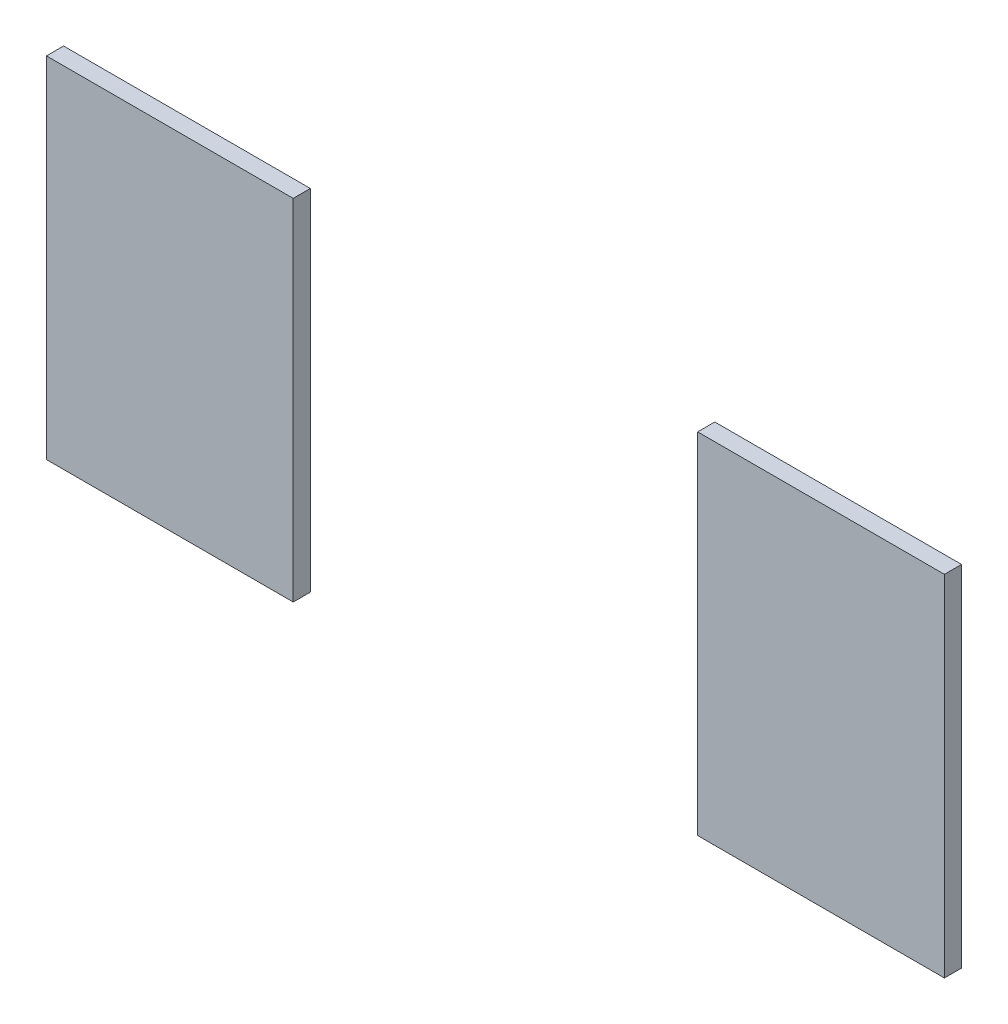
ISO-10303-21;
HEADER;
FILE_DESCRIPTION(('STEP AP214'),'2;1');
FILE_NAME('part.step','',(''),(''),'','','');
FILE_SCHEMA(('AUTOMOTIVE_DESIGN { 1 0 10303 214 1 1 1 1 }'));
ENDSEC;
DATA;
#1=APPLICATION_CONTEXT('core data for automotive mechanical design processes');
#2=APPLICATION_PROTOCOL_DEFINITION('international standard','automotive_design',2000,#1);
#3=PRODUCT_CONTEXT('',#1,'mechanical');
#4=PRODUCT('Part','Part','',(#3));
#5=PRODUCT_RELATED_PRODUCT_CATEGORY('part','',(#4));
#6=PRODUCT_DEFINITION_FORMATION('','',#4);
#7=PRODUCT_DEFINITION_CONTEXT('part definition',#1,'design');
#8=PRODUCT_DEFINITION('design','',#6,#7);
#9=PRODUCT_DEFINITION_SHAPE('','',#8);
#10=(LENGTH_UNIT() NAMED_UNIT(*) SI_UNIT(.MILLI.,.METRE.));
#11=(NAMED_UNIT(*) PLANE_ANGLE_UNIT() SI_UNIT($,.RADIAN.));
#12=(NAMED_UNIT(*) SI_UNIT($,.STERADIAN.) SOLID_ANGLE_UNIT());
#13=UNCERTAINTY_MEASURE_WITH_UNIT(LENGTH_MEASURE(1.E-05),#10,'distance_accuracy_value','');
#14=(GEOMETRIC_REPRESENTATION_CONTEXT(3) GLOBAL_UNCERTAINTY_ASSIGNED_CONTEXT((#13)) GLOBAL_UNIT_ASSIGNED_CONTEXT((#10,
#11,#12)) REPRESENTATION_CONTEXT('',''));
#15=CARTESIAN_POINT('',(0.,0.,0.));
#16=DIRECTION('',(0.,0.,1.));
#17=DIRECTION('',(1.,0.,0.));
#18=AXIS2_PLACEMENT_3D('',#15,#16,#17);
#19=CARTESIAN_POINT('',(-2.62,-1.02,0.1));
#20=DIRECTION('',(0.,0.,1.));
#21=DIRECTION('',(1.,0.,0.));
#22=AXIS2_PLACEMENT_3D('',#19,#20,#21);
#23=PLANE('',#22);
#24=DIRECTION('',(0.,1.,0.));
#25=VECTOR('',#24,1.);
#26=CARTESIAN_POINT('',(-2.62,-1.02,0.1));
#27=LINE('',#26,#25);
#28=CARTESIAN_POINT('',(-2.62,-1.02,0.1));
#29=VERTEX_POINT('',#28);
#30=CARTESIAN_POINT('',(-2.62,1.02,0.1));
#31=VERTEX_POINT('',#30);
#32=EDGE_CURVE('P0_E96',#29,#31,#27,.T.);
#33=ORIENTED_EDGE('',*,*,#32,.F.);
#34=DIRECTION('',(1.,0.,0.));
#35=VECTOR('',#34,1.);
#36=CARTESIAN_POINT('',(-2.62,-1.02,0.1));
#37=LINE('',#36,#35);
#38=CARTESIAN_POINT('',(-1.18,-1.02,0.1));
#39=VERTEX_POINT('',#38);
#40=EDGE_CURVE('P0_E78',#29,#39,#37,.T.);
#41=ORIENTED_EDGE('',*,*,#40,.T.);
#42=DIRECTION('',(0.,1.,0.));
#43=VECTOR('',#42,1.);
#44=CARTESIAN_POINT('',(-1.18,-1.02,0.1));
#45=LINE('',#44,#43);
#46=CARTESIAN_POINT('',(-1.18,1.02,0.1));
#47=VERTEX_POINT('',#46);
#48=EDGE_CURVE('P0_E107',#39,#47,#45,.T.);
#49=ORIENTED_EDGE('',*,*,#48,.T.);
#50=DIRECTION('',(1.,0.,0.));
#51=VECTOR('',#50,1.);
#52=CARTESIAN_POINT('',(-2.62,1.02,0.1));
#53=LINE('',#52,#51);
#54=EDGE_CURVE('P0_E11',#31,#47,#53,.T.);
#55=ORIENTED_EDGE('',*,*,#54,.F.);
#56=EDGE_LOOP('',(#33,#41,#49,#55));
#57=FACE_BOUND('',#56,.T.);
#58=ADVANCED_FACE('P0_F17',(#57),#23,.T.);
#59=CARTESIAN_POINT('',(-2.62,-1.02,0.));
#60=DIRECTION('',(0.,0.,1.));
#61=DIRECTION('',(1.,0.,0.));
#62=AXIS2_PLACEMENT_3D('',#59,#60,#61);
#63=PLANE('',#62);
#64=DIRECTION('',(1.,0.,0.));
#65=VECTOR('',#64,1.);
#66=CARTESIAN_POINT('',(-2.62,1.02,0.));
#67=LINE('',#66,#65);
#68=CARTESIAN_POINT('',(-2.62,1.02,0.));
#69=VERTEX_POINT('',#68);
#70=CARTESIAN_POINT('',(-1.18,1.02,0.));
#71=VERTEX_POINT('',#70);
#72=EDGE_CURVE('P0_E27',#69,#71,#67,.T.);
#73=ORIENTED_EDGE('',*,*,#72,.T.);
#74=DIRECTION('',(0.,1.,0.));
#75=VECTOR('',#74,1.);
#76=CARTESIAN_POINT('',(-1.18,-1.02,0.));
#77=LINE('',#76,#75);
#78=CARTESIAN_POINT('',(-1.18,-1.02,0.));
#79=VERTEX_POINT('',#78);
#80=EDGE_CURVE('P0_E73',#79,#71,#77,.T.);
#81=ORIENTED_EDGE('',*,*,#80,.F.);
#82=DIRECTION('',(1.,0.,0.));
#83=VECTOR('',#82,1.);
#84=CARTESIAN_POINT('',(-2.62,-1.02,0.));
#85=LINE('',#84,#83);
#86=CARTESIAN_POINT('',(-2.62,-1.02,0.));
#87=VERTEX_POINT('',#86);
#88=EDGE_CURVE('P0_E20',#87,#79,#85,.T.);
#89=ORIENTED_EDGE('',*,*,#88,.F.);
#90=DIRECTION('',(0.,1.,0.));
#91=VECTOR('',#90,1.);
#92=CARTESIAN_POINT('',(-2.62,-1.02,0.));
#93=LINE('',#92,#91);
#94=EDGE_CURVE('P0_E70',#87,#69,#93,.T.);
#95=ORIENTED_EDGE('',*,*,#94,.T.);
#96=EDGE_LOOP('',(#73,#81,#89,#95));
#97=FACE_BOUND('',#96,.T.);
#98=ADVANCED_FACE('P0_F68',(#97),#63,.F.);
#99=CARTESIAN_POINT('',(-2.62,1.02,0.));
#100=DIRECTION('',(0.,1.,0.));
#101=DIRECTION('',(1.,0.,0.));
#102=AXIS2_PLACEMENT_3D('',#99,#100,#101);
#103=PLANE('',#102);
#104=ORIENTED_EDGE('',*,*,#72,.F.);
#105=DIRECTION('',(0.,0.,1.));
#106=VECTOR('',#105,1.);
#107=CARTESIAN_POINT('',(-2.62,1.02,0.));
#108=LINE('',#107,#106);
#109=EDGE_CURVE('P0_E89',#69,#31,#108,.T.);
#110=ORIENTED_EDGE('',*,*,#109,.T.);
#111=ORIENTED_EDGE('',*,*,#54,.T.);
#112=DIRECTION('',(0.,0.,1.));
#113=VECTOR('',#112,1.);
#114=CARTESIAN_POINT('',(-1.18,1.02,0.));
#115=LINE('',#114,#113);
#116=EDGE_CURVE('P0_E104',#71,#47,#115,.T.);
#117=ORIENTED_EDGE('',*,*,#116,.F.);
#118=EDGE_LOOP('',(#104,#110,#111,#117));
#119=FACE_BOUND('',#118,.T.);
#120=ADVANCED_FACE('P0_F124',(#119),#103,.T.);
#121=CARTESIAN_POINT('',(-2.62,-1.02,0.));
#122=DIRECTION('',(0.,1.,0.));
#123=DIRECTION('',(1.,0.,0.));
#124=AXIS2_PLACEMENT_3D('',#121,#122,#123);
#125=PLANE('',#124);
#126=DIRECTION('',(0.,0.,1.));
#127=VECTOR('',#126,1.);
#128=CARTESIAN_POINT('',(-1.18,-1.02,0.));
#129=LINE('',#128,#127);
#130=EDGE_CURVE('P0_E86',#79,#39,#129,.T.);
#131=ORIENTED_EDGE('',*,*,#130,.T.);
#132=ORIENTED_EDGE('',*,*,#40,.F.);
#133=DIRECTION('',(0.,0.,1.));
#134=VECTOR('',#133,1.);
#135=CARTESIAN_POINT('',(-2.62,-1.02,0.));
#136=LINE('',#135,#134);
#137=EDGE_CURVE('P0_E80',#87,#29,#136,.T.);
#138=ORIENTED_EDGE('',*,*,#137,.F.);
#139=ORIENTED_EDGE('',*,*,#88,.T.);
#140=EDGE_LOOP('',(#131,#132,#138,#139));
#141=FACE_BOUND('',#140,.T.);
#142=ADVANCED_FACE('P0_F81',(#141),#125,.F.);
#143=CARTESIAN_POINT('',(-1.18,-1.02,0.));
#144=DIRECTION('',(1.,0.,0.));
#145=DIRECTION('',(0.,1.,0.));
#146=AXIS2_PLACEMENT_3D('',#143,#144,#145);
#147=PLANE('',#146);
#148=ORIENTED_EDGE('',*,*,#130,.F.);
#149=ORIENTED_EDGE('',*,*,#80,.T.);
#150=ORIENTED_EDGE('',*,*,#116,.T.);
#151=ORIENTED_EDGE('',*,*,#48,.F.);
#152=EDGE_LOOP('',(#148,#149,#150,#151));
#153=FACE_BOUND('',#152,.T.);
#154=ADVANCED_FACE('P0_F123',(#153),#147,.T.);
#155=CARTESIAN_POINT('',(-2.62,-1.02,0.));
#156=DIRECTION('',(1.,0.,0.));
#157=DIRECTION('',(0.,1.,0.));
#158=AXIS2_PLACEMENT_3D('',#155,#156,#157);
#159=PLANE('',#158);
#160=ORIENTED_EDGE('',*,*,#32,.T.);
#161=ORIENTED_EDGE('',*,*,#109,.F.);
#162=ORIENTED_EDGE('',*,*,#94,.F.);
#163=ORIENTED_EDGE('',*,*,#137,.T.);
#164=EDGE_LOOP('',(#160,#161,#162,#163));
#165=FACE_BOUND('',#164,.T.);
#166=ADVANCED_FACE('P0_F88',(#165),#159,.F.);
#167=CLOSED_SHELL('',(#58,#98,#120,#142,#154,#166));
#168=MANIFOLD_SOLID_BREP('P0_B1',#167);
#169=CARTESIAN_POINT('',(1.18,-1.02,0.1));
#170=DIRECTION('',(0.,0.,1.));
#171=DIRECTION('',(1.,0.,0.));
#172=AXIS2_PLACEMENT_3D('',#169,#170,#171);
#173=PLANE('',#172);
#174=DIRECTION('',(0.,1.,0.));
#175=VECTOR('',#174,1.);
#176=CARTESIAN_POINT('',(1.18,-1.02,0.1));
#177=LINE('',#176,#175);
#178=CARTESIAN_POINT('',(1.18,-1.02,0.1));
#179=VERTEX_POINT('',#178);
#180=CARTESIAN_POINT('',(1.18,1.02,0.1));
#181=VERTEX_POINT('',#180);
#182=EDGE_CURVE('P1_E108',#179,#181,#177,.T.);
#183=ORIENTED_EDGE('',*,*,#182,.F.);
#184=DIRECTION('',(1.,0.,0.));
#185=VECTOR('',#184,1.);
#186=CARTESIAN_POINT('',(1.18,-1.02,0.1));
#187=LINE('',#186,#185);
#188=CARTESIAN_POINT('',(2.62,-1.02,0.1));
#189=VERTEX_POINT('',#188);
#190=EDGE_CURVE('P1_E76',#179,#189,#187,.T.);
#191=ORIENTED_EDGE('',*,*,#190,.T.);
#192=DIRECTION('',(0.,1.,0.));
#193=VECTOR('',#192,1.);
#194=CARTESIAN_POINT('',(2.62,-1.02,0.1));
#195=LINE('',#194,#193);
#196=CARTESIAN_POINT('',(2.62,1.02,0.1));
#197=VERTEX_POINT('',#196);
#198=EDGE_CURVE('P1_E87',#189,#197,#195,.T.);
#199=ORIENTED_EDGE('',*,*,#198,.T.);
#200=DIRECTION('',(1.,0.,0.));
#201=VECTOR('',#200,1.);
#202=CARTESIAN_POINT('',(1.18,1.02,0.1));
#203=LINE('',#202,#201);
#204=EDGE_CURVE('P1_E11',#181,#197,#203,.T.);
#205=ORIENTED_EDGE('',*,*,#204,.F.);
#206=EDGE_LOOP('',(#183,#191,#199,#205));
#207=FACE_BOUND('',#206,.T.);
#208=ADVANCED_FACE('P1_F17',(#207),#173,.T.);
#209=CARTESIAN_POINT('',(1.18,-1.02,0.));
#210=DIRECTION('',(0.,0.,1.));
#211=DIRECTION('',(1.,0.,0.));
#212=AXIS2_PLACEMENT_3D('',#209,#210,#211);
#213=PLANE('',#212);
#214=DIRECTION('',(1.,0.,0.));
#215=VECTOR('',#214,1.);
#216=CARTESIAN_POINT('',(1.18,1.02,0.));
#217=LINE('',#216,#215);
#218=CARTESIAN_POINT('',(1.18,1.02,0.));
#219=VERTEX_POINT('',#218);
#220=CARTESIAN_POINT('',(2.62,1.02,0.));
#221=VERTEX_POINT('',#220);
#222=EDGE_CURVE('P1_E26',#219,#221,#217,.T.);
#223=ORIENTED_EDGE('',*,*,#222,.T.);
#224=DIRECTION('',(0.,1.,0.));
#225=VECTOR('',#224,1.);
#226=CARTESIAN_POINT('',(2.62,-1.02,0.));
#227=LINE('',#226,#225);
#228=CARTESIAN_POINT('',(2.62,-1.02,0.));
#229=VERTEX_POINT('',#228);
#230=EDGE_CURVE('P1_E78',#229,#221,#227,.T.);
#231=ORIENTED_EDGE('',*,*,#230,.F.);
#232=DIRECTION('',(1.,0.,0.));
#233=VECTOR('',#232,1.);
#234=CARTESIAN_POINT('',(1.18,-1.02,0.));
#235=LINE('',#234,#233);
#236=CARTESIAN_POINT('',(1.18,-1.02,0.));
#237=VERTEX_POINT('',#236);
#238=EDGE_CURVE('P1_E20',#237,#229,#235,.T.);
#239=ORIENTED_EDGE('',*,*,#238,.F.);
#240=DIRECTION('',(0.,1.,0.));
#241=VECTOR('',#240,1.);
#242=CARTESIAN_POINT('',(1.18,-1.02,0.));
#243=LINE('',#242,#241);
#244=EDGE_CURVE('P1_E94',#237,#219,#243,.T.);
#245=ORIENTED_EDGE('',*,*,#244,.T.);
#246=EDGE_LOOP('',(#223,#231,#239,#245));
#247=FACE_BOUND('',#246,.T.);
#248=ADVANCED_FACE('P1_F79',(#247),#213,.F.);
#249=CARTESIAN_POINT('',(1.18,1.02,0.));
#250=DIRECTION('',(0.,1.,0.));
#251=DIRECTION('',(1.,0.,0.));
#252=AXIS2_PLACEMENT_3D('',#249,#250,#251);
#253=PLANE('',#252);
#254=ORIENTED_EDGE('',*,*,#222,.F.);
#255=DIRECTION('',(0.,0.,1.));
#256=VECTOR('',#255,1.);
#257=CARTESIAN_POINT('',(1.18,1.02,0.));
#258=LINE('',#257,#256);
#259=EDGE_CURVE('P1_E113',#219,#181,#258,.T.);
#260=ORIENTED_EDGE('',*,*,#259,.T.);
#261=ORIENTED_EDGE('',*,*,#204,.T.);
#262=DIRECTION('',(0.,0.,1.));
#263=VECTOR('',#262,1.);
#264=CARTESIAN_POINT('',(2.62,1.02,0.));
#265=LINE('',#264,#263);
#266=EDGE_CURVE('P1_E83',#221,#197,#265,.T.);
#267=ORIENTED_EDGE('',*,*,#266,.F.);
#268=EDGE_LOOP('',(#254,#260,#261,#267));
#269=FACE_BOUND('',#268,.T.);
#270=ADVANCED_FACE('P1_F161',(#269),#253,.T.);
#271=CARTESIAN_POINT('',(1.18,-1.02,0.));
#272=DIRECTION('',(0.,1.,0.));
#273=DIRECTION('',(1.,0.,0.));
#274=AXIS2_PLACEMENT_3D('',#271,#272,#273);
#275=PLANE('',#274);
#276=DIRECTION('',(0.,0.,1.));
#277=VECTOR('',#276,1.);
#278=CARTESIAN_POINT('',(2.62,-1.02,0.));
#279=LINE('',#278,#277);
#280=EDGE_CURVE('P1_E71',#229,#189,#279,.T.);
#281=ORIENTED_EDGE('',*,*,#280,.T.);
#282=ORIENTED_EDGE('',*,*,#190,.F.);
#283=DIRECTION('',(0.,0.,1.));
#284=VECTOR('',#283,1.);
#285=CARTESIAN_POINT('',(1.18,-1.02,0.));
#286=LINE('',#285,#284);
#287=EDGE_CURVE('P1_E73',#237,#179,#286,.T.);
#288=ORIENTED_EDGE('',*,*,#287,.F.);
#289=ORIENTED_EDGE('',*,*,#238,.T.);
#290=EDGE_LOOP('',(#281,#282,#288,#289));
#291=FACE_BOUND('',#290,.T.);
#292=ADVANCED_FACE('P1_F68',(#291),#275,.F.);
#293=CARTESIAN_POINT('',(2.62,-1.02,0.));
#294=DIRECTION('',(1.,0.,0.));
#295=DIRECTION('',(0.,1.,0.));
#296=AXIS2_PLACEMENT_3D('',#293,#294,#295);
#297=PLANE('',#296);
#298=ORIENTED_EDGE('',*,*,#280,.F.);
#299=ORIENTED_EDGE('',*,*,#230,.T.);
#300=ORIENTED_EDGE('',*,*,#266,.T.);
#301=ORIENTED_EDGE('',*,*,#198,.F.);
#302=EDGE_LOOP('',(#298,#299,#300,#301));
#303=FACE_BOUND('',#302,.T.);
#304=ADVANCED_FACE('P1_F86',(#303),#297,.T.);
#305=CARTESIAN_POINT('',(1.18,-1.02,0.));
#306=DIRECTION('',(1.,0.,0.));
#307=DIRECTION('',(0.,1.,0.));
#308=AXIS2_PLACEMENT_3D('',#305,#306,#307);
#309=PLANE('',#308);
#310=ORIENTED_EDGE('',*,*,#182,.T.);
#311=ORIENTED_EDGE('',*,*,#259,.F.);
#312=ORIENTED_EDGE('',*,*,#244,.F.);
#313=ORIENTED_EDGE('',*,*,#287,.T.);
#314=EDGE_LOOP('',(#310,#311,#312,#313));
#315=FACE_BOUND('',#314,.T.);
#316=ADVANCED_FACE('P1_F111',(#315),#309,.F.);
#317=CLOSED_SHELL('',(#208,#248,#270,#292,#304,#316));
#318=MANIFOLD_SOLID_BREP('P1_B1',#317);
#319=ADVANCED_BREP_SHAPE_REPRESENTATION('',(#18,#168,#318),#14);
#320=SHAPE_DEFINITION_REPRESENTATION(#9,#319);
ENDSEC;
END-ISO-10303-21;
